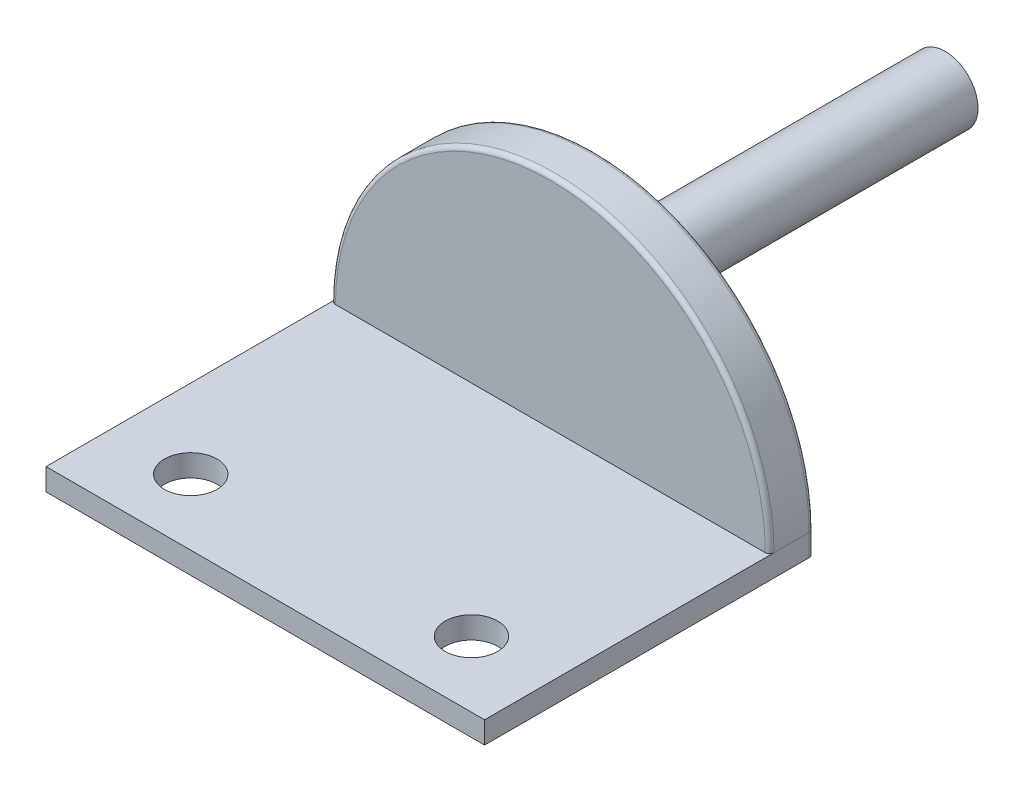
ISO-10303-21;
HEADER;
FILE_DESCRIPTION(('STEP AP214'),'2;1');
FILE_NAME('part.step','',(''),(''),'','','');
FILE_SCHEMA(('AUTOMOTIVE_DESIGN { 1 0 10303 214 1 1 1 1 }'));
ENDSEC;
DATA;
#1=APPLICATION_CONTEXT('core data for automotive mechanical design processes');
#2=APPLICATION_PROTOCOL_DEFINITION('international standard','automotive_design',2000,#1);
#3=PRODUCT_CONTEXT('',#1,'mechanical');
#4=PRODUCT('Part','Part','',(#3));
#5=PRODUCT_RELATED_PRODUCT_CATEGORY('part','',(#4));
#6=PRODUCT_DEFINITION_FORMATION('','',#4);
#7=PRODUCT_DEFINITION_CONTEXT('part definition',#1,'design');
#8=PRODUCT_DEFINITION('design','',#6,#7);
#9=PRODUCT_DEFINITION_SHAPE('','',#8);
#10=(LENGTH_UNIT() NAMED_UNIT(*) SI_UNIT(.MILLI.,.METRE.));
#11=(NAMED_UNIT(*) PLANE_ANGLE_UNIT() SI_UNIT($,.RADIAN.));
#12=(NAMED_UNIT(*) SI_UNIT($,.STERADIAN.) SOLID_ANGLE_UNIT());
#13=UNCERTAINTY_MEASURE_WITH_UNIT(LENGTH_MEASURE(1.E-05),#10,'distance_accuracy_value','');
#14=(GEOMETRIC_REPRESENTATION_CONTEXT(3) GLOBAL_UNCERTAINTY_ASSIGNED_CONTEXT((#13)) GLOBAL_UNIT_ASSIGNED_CONTEXT((#10,
#11,#12)) REPRESENTATION_CONTEXT('',''));
#15=CARTESIAN_POINT('',(0.,0.,0.));
#16=DIRECTION('',(0.,0.,1.));
#17=DIRECTION('',(1.,0.,0.));
#18=AXIS2_PLACEMENT_3D('',#15,#16,#17);
#19=CARTESIAN_POINT('',(50.,5.,-37.5));
#20=DIRECTION('',(-1.,0.,0.));
#21=DIRECTION('',(0.,0.,1.));
#22=AXIS2_PLACEMENT_3D('',#19,#20,#21);
#23=PLANE('',#22);
#24=DIRECTION('',(0.,0.,-1.));
#25=VECTOR('',#24,1.);
#26=CARTESIAN_POINT('',(50.,0.,-37.5));
#27=LINE('',#26,#25);
#28=CARTESIAN_POINT('',(50.,0.,37.5));
#29=VERTEX_POINT('',#28);
#30=CARTESIAN_POINT('',(50.,0.,-36.5));
#31=VERTEX_POINT('',#30);
#32=EDGE_CURVE('E129',#29,#31,#27,.T.);
#33=ORIENTED_EDGE('',*,*,#32,.T.);
#34=DIRECTION('',(0.,-1.,0.));
#35=VECTOR('',#34,1.);
#36=CARTESIAN_POINT('',(50.,5.,-36.5));
#37=LINE('',#36,#35);
#38=CARTESIAN_POINT('',(50.,5.00000000000001,-36.5));
#39=VERTEX_POINT('',#38);
#40=EDGE_CURVE('E149',#31,#39,#37,.F.);
#41=ORIENTED_EDGE('',*,*,#40,.T.);
#42=DIRECTION('',(0.,0.,-1.));
#43=VECTOR('',#42,1.);
#44=CARTESIAN_POINT('',(50.,5.00000000000001,143.206253546846));
#45=LINE('',#44,#43);
#46=CARTESIAN_POINT('',(50.,5.,-28.5));
#47=VERTEX_POINT('',#46);
#48=EDGE_CURVE('E173',#47,#39,#45,.T.);
#49=ORIENTED_EDGE('',*,*,#48,.F.);
#50=DIRECTION('',(0.,0.,-1.));
#51=VECTOR('',#50,1.);
#52=CARTESIAN_POINT('',(50.,5.,-37.5));
#53=LINE('',#52,#51);
#54=CARTESIAN_POINT('',(50.,5.,37.5));
#55=VERTEX_POINT('',#54);
#56=EDGE_CURVE('E71',#55,#47,#53,.T.);
#57=ORIENTED_EDGE('',*,*,#56,.F.);
#58=DIRECTION('',(0.,-1.,0.));
#59=VECTOR('',#58,1.);
#60=CARTESIAN_POINT('',(50.,5.,37.5));
#61=LINE('',#60,#59);
#62=EDGE_CURVE('E121',#55,#29,#61,.T.);
#63=ORIENTED_EDGE('',*,*,#62,.T.);
#64=EDGE_LOOP('',(#33,#41,#49,#57,#63));
#65=FACE_BOUND('',#64,.T.);
#66=ADVANCED_FACE('F39',(#65),#23,.F.);
#67=CARTESIAN_POINT('',(-50.,5.,-37.5));
#68=DIRECTION('',(0.,0.,1.));
#69=DIRECTION('',(1.,0.,0.));
#70=AXIS2_PLACEMENT_3D('',#67,#68,#69);
#71=PLANE('',#70);
#72=CARTESIAN_POINT('',(0.,27.,-37.5));
#73=DIRECTION('',(0.,0.,1.));
#74=DIRECTION('',(1.,0.,0.));
#75=AXIS2_PLACEMENT_3D('',#72,#73,#74);
#76=CIRCLE('',#75,7.5);
#77=CARTESIAN_POINT('',(7.5,27.,-37.5));
#78=VERTEX_POINT('',#77);
#79=EDGE_CURVE('E161',#78,#78,#76,.T.);
#80=ORIENTED_EDGE('',*,*,#79,.T.);
#81=EDGE_LOOP('',(#80));
#82=FACE_BOUND('',#81,.T.);
#83=CARTESIAN_POINT('',(0.,5.,-37.5));
#84=DIRECTION('',(0.,0.,1.));
#85=DIRECTION('',(1.,0.,0.));
#86=AXIS2_PLACEMENT_3D('',#83,#84,#85);
#87=CIRCLE('',#86,49.);
#88=CARTESIAN_POINT('',(-49.,5.,-37.5));
#89=VERTEX_POINT('',#88);
#90=CARTESIAN_POINT('',(49.,5.00000000000001,-37.5));
#91=VERTEX_POINT('',#90);
#92=EDGE_CURVE('E120',#89,#91,#87,.F.);
#93=ORIENTED_EDGE('',*,*,#92,.T.);
#94=DIRECTION('',(0.,-1.,0.));
#95=VECTOR('',#94,1.);
#96=CARTESIAN_POINT('',(49.,5.,-37.5));
#97=LINE('',#96,#95);
#98=CARTESIAN_POINT('',(49.,0.,-37.5));
#99=VERTEX_POINT('',#98);
#100=EDGE_CURVE('E142',#91,#99,#97,.T.);
#101=ORIENTED_EDGE('',*,*,#100,.T.);
#102=DIRECTION('',(-1.,0.,0.));
#103=VECTOR('',#102,1.);
#104=CARTESIAN_POINT('',(-50.,0.,-37.5));
#105=LINE('',#104,#103);
#106=CARTESIAN_POINT('',(-49.,0.,-37.5));
#107=VERTEX_POINT('',#106);
#108=EDGE_CURVE('E132',#99,#107,#105,.T.);
#109=ORIENTED_EDGE('',*,*,#108,.T.);
#110=DIRECTION('',(0.,-1.,0.));
#111=VECTOR('',#110,1.);
#112=CARTESIAN_POINT('',(-49.,5.,-37.5));
#113=LINE('',#112,#111);
#114=EDGE_CURVE('E140',#107,#89,#113,.F.);
#115=ORIENTED_EDGE('',*,*,#114,.T.);
#116=EDGE_LOOP('',(#93,#101,#109,#115));
#117=FACE_BOUND('',#116,.T.);
#118=ADVANCED_FACE('F214',(#82,#117),#71,.F.);
#119=CARTESIAN_POINT('',(-50.,55.,-27.5));
#120=DIRECTION('',(0.,0.,-1.));
#121=DIRECTION('',(-1.,0.,0.));
#122=AXIS2_PLACEMENT_3D('',#119,#120,#121);
#123=PLANE('',#122);
#124=DIRECTION('',(1.,0.,0.));
#125=VECTOR('',#124,1.);
#126=CARTESIAN_POINT('',(-50.,5.,-27.5));
#127=LINE('',#126,#125);
#128=CARTESIAN_POINT('',(-49.,5.,-27.5));
#129=VERTEX_POINT('',#128);
#130=CARTESIAN_POINT('',(49.,5.,-27.5));
#131=VERTEX_POINT('',#130);
#132=EDGE_CURVE('E170',#129,#131,#127,.T.);
#133=ORIENTED_EDGE('',*,*,#132,.T.);
#134=CARTESIAN_POINT('',(0.,5.,-27.5));
#135=DIRECTION('',(0.,0.,-1.));
#136=DIRECTION('',(-1.,0.,0.));
#137=AXIS2_PLACEMENT_3D('',#134,#135,#136);
#138=CIRCLE('',#137,49.);
#139=EDGE_CURVE('E166',#131,#129,#138,.F.);
#140=ORIENTED_EDGE('',*,*,#139,.T.);
#141=EDGE_LOOP('',(#133,#140));
#142=FACE_BOUND('',#141,.T.);
#143=ADVANCED_FACE('F169',(#142),#123,.F.);
#144=CARTESIAN_POINT('',(0.,5.,0.));
#145=DIRECTION('',(0.,1.,0.));
#146=DIRECTION('',(0.,0.,1.));
#147=AXIS2_PLACEMENT_3D('',#144,#145,#146);
#148=PLANE('',#147);
#149=ORIENTED_EDGE('',*,*,#132,.F.);
#150=CARTESIAN_POINT('',(-49.,5.,-28.5));
#151=DIRECTION('',(0.,1.,0.));
#152=DIRECTION('',(0.,0.,1.));
#153=AXIS2_PLACEMENT_3D('',#150,#151,#152);
#154=CIRCLE('',#153,1.);
#155=CARTESIAN_POINT('',(-50.,5.,-28.5));
#156=VERTEX_POINT('',#155);
#157=EDGE_CURVE('E11',#129,#156,#154,.F.);
#158=ORIENTED_EDGE('',*,*,#157,.T.);
#159=DIRECTION('',(0.,0.,1.));
#160=VECTOR('',#159,1.);
#161=CARTESIAN_POINT('',(-50.,5.,-37.5));
#162=LINE('',#161,#160);
#163=CARTESIAN_POINT('',(-50.,5.,37.5));
#164=VERTEX_POINT('',#163);
#165=EDGE_CURVE('E54',#156,#164,#162,.T.);
#166=ORIENTED_EDGE('',*,*,#165,.T.);
#167=DIRECTION('',(1.,0.,0.));
#168=VECTOR('',#167,1.);
#169=CARTESIAN_POINT('',(-50.,5.,37.5));
#170=LINE('',#169,#168);
#171=EDGE_CURVE('E108',#164,#55,#170,.T.);
#172=ORIENTED_EDGE('',*,*,#171,.T.);
#173=ORIENTED_EDGE('',*,*,#56,.T.);
#174=CARTESIAN_POINT('',(49.,5.,-28.5));
#175=DIRECTION('',(0.,1.,0.));
#176=DIRECTION('',(0.,0.,1.));
#177=AXIS2_PLACEMENT_3D('',#174,#175,#176);
#178=CIRCLE('',#177,1.);
#179=EDGE_CURVE('E47',#47,#131,#178,.F.);
#180=ORIENTED_EDGE('',*,*,#179,.T.);
#181=EDGE_LOOP('',(#149,#158,#166,#172,#173,#180));
#182=FACE_BOUND('',#181,.T.);
#183=CARTESIAN_POINT('',(-32.,5.,22.5));
#184=DIRECTION('',(0.,1.,0.));
#185=DIRECTION('',(0.,0.,1.));
#186=AXIS2_PLACEMENT_3D('',#183,#184,#185);
#187=CIRCLE('',#186,6.);
#188=CARTESIAN_POINT('',(-32.,5.,28.5));
#189=VERTEX_POINT('',#188);
#190=EDGE_CURVE('E133',#189,#189,#187,.T.);
#191=ORIENTED_EDGE('',*,*,#190,.F.);
#192=EDGE_LOOP('',(#191));
#193=FACE_BOUND('',#192,.T.);
#194=CARTESIAN_POINT('',(32.,5.,22.5));
#195=DIRECTION('',(0.,1.,0.));
#196=DIRECTION('',(0.,0.,1.));
#197=AXIS2_PLACEMENT_3D('',#194,#195,#196);
#198=CIRCLE('',#197,5.99999999999999);
#199=CARTESIAN_POINT('',(32.,5.,28.5));
#200=VERTEX_POINT('',#199);
#201=EDGE_CURVE('E186',#200,#200,#198,.T.);
#202=ORIENTED_EDGE('',*,*,#201,.F.);
#203=EDGE_LOOP('',(#202));
#204=FACE_BOUND('',#203,.T.);
#205=ADVANCED_FACE('F105',(#182,#193,#204),#148,.T.);
#206=CARTESIAN_POINT('',(0.,0.,0.));
#207=DIRECTION('',(0.,1.,0.));
#208=DIRECTION('',(0.,0.,1.));
#209=AXIS2_PLACEMENT_3D('',#206,#207,#208);
#210=PLANE('',#209);
#211=ORIENTED_EDGE('',*,*,#108,.F.);
#212=CARTESIAN_POINT('',(49.,0.,-36.5));
#213=DIRECTION('',(0.,1.,0.));
#214=DIRECTION('',(0.,0.,1.));
#215=AXIS2_PLACEMENT_3D('',#212,#213,#214);
#216=CIRCLE('',#215,1.);
#217=EDGE_CURVE('E147',#99,#31,#216,.F.);
#218=ORIENTED_EDGE('',*,*,#217,.T.);
#219=ORIENTED_EDGE('',*,*,#32,.F.);
#220=DIRECTION('',(1.,0.,0.));
#221=VECTOR('',#220,1.);
#222=CARTESIAN_POINT('',(-50.,0.,37.5));
#223=LINE('',#222,#221);
#224=CARTESIAN_POINT('',(-50.,0.,37.5));
#225=VERTEX_POINT('',#224);
#226=EDGE_CURVE('E137',#225,#29,#223,.T.);
#227=ORIENTED_EDGE('',*,*,#226,.F.);
#228=DIRECTION('',(0.,0.,1.));
#229=VECTOR('',#228,1.);
#230=CARTESIAN_POINT('',(-50.,0.,-37.5));
#231=LINE('',#230,#229);
#232=CARTESIAN_POINT('',(-50.,0.,-36.5));
#233=VERTEX_POINT('',#232);
#234=EDGE_CURVE('E117',#233,#225,#231,.T.);
#235=ORIENTED_EDGE('',*,*,#234,.F.);
#236=CARTESIAN_POINT('',(-49.,0.,-36.5));
#237=DIRECTION('',(0.,1.,0.));
#238=DIRECTION('',(0.,0.,1.));
#239=AXIS2_PLACEMENT_3D('',#236,#237,#238);
#240=CIRCLE('',#239,1.);
#241=EDGE_CURVE('E145',#233,#107,#240,.F.);
#242=ORIENTED_EDGE('',*,*,#241,.T.);
#243=EDGE_LOOP('',(#211,#218,#219,#227,#235,#242));
#244=FACE_BOUND('',#243,.T.);
#245=CARTESIAN_POINT('',(-32.,0.,22.5));
#246=DIRECTION('',(0.,1.,0.));
#247=DIRECTION('',(0.,0.,1.));
#248=AXIS2_PLACEMENT_3D('',#245,#246,#247);
#249=CIRCLE('',#248,6.);
#250=CARTESIAN_POINT('',(-32.,0.,28.5));
#251=VERTEX_POINT('',#250);
#252=EDGE_CURVE('E189',#251,#251,#249,.T.);
#253=ORIENTED_EDGE('',*,*,#252,.T.);
#254=EDGE_LOOP('',(#253));
#255=FACE_BOUND('',#254,.T.);
#256=CARTESIAN_POINT('',(32.,0.,22.5));
#257=DIRECTION('',(0.,1.,0.));
#258=DIRECTION('',(0.,0.,1.));
#259=AXIS2_PLACEMENT_3D('',#256,#257,#258);
#260=CIRCLE('',#259,5.99999999999999);
#261=CARTESIAN_POINT('',(32.,0.,28.5));
#262=VERTEX_POINT('',#261);
#263=EDGE_CURVE('E172',#262,#262,#260,.T.);
#264=ORIENTED_EDGE('',*,*,#263,.T.);
#265=EDGE_LOOP('',(#264));
#266=FACE_BOUND('',#265,.T.);
#267=ADVANCED_FACE('F197',(#244,#255,#266),#210,.F.);
#268=CARTESIAN_POINT('',(-50.,5.,-37.5));
#269=DIRECTION('',(1.,0.,0.));
#270=DIRECTION('',(0.,0.,-1.));
#271=AXIS2_PLACEMENT_3D('',#268,#269,#270);
#272=PLANE('',#271);
#273=ORIENTED_EDGE('',*,*,#165,.F.);
#274=DIRECTION('',(0.,0.,-1.));
#275=VECTOR('',#274,1.);
#276=CARTESIAN_POINT('',(-50.,5.,143.206253546846));
#277=LINE('',#276,#275);
#278=CARTESIAN_POINT('',(-50.,5.,-36.5));
#279=VERTEX_POINT('',#278);
#280=EDGE_CURVE('E74',#156,#279,#277,.T.);
#281=ORIENTED_EDGE('',*,*,#280,.T.);
#282=DIRECTION('',(0.,-1.,0.));
#283=VECTOR('',#282,1.);
#284=CARTESIAN_POINT('',(-50.,5.,-36.5));
#285=LINE('',#284,#283);
#286=EDGE_CURVE('E152',#279,#233,#285,.T.);
#287=ORIENTED_EDGE('',*,*,#286,.T.);
#288=ORIENTED_EDGE('',*,*,#234,.T.);
#289=DIRECTION('',(0.,-1.,0.));
#290=VECTOR('',#289,1.);
#291=CARTESIAN_POINT('',(-50.,5.,37.5));
#292=LINE('',#291,#290);
#293=EDGE_CURVE('E114',#164,#225,#292,.T.);
#294=ORIENTED_EDGE('',*,*,#293,.F.);
#295=EDGE_LOOP('',(#273,#281,#287,#288,#294));
#296=FACE_BOUND('',#295,.T.);
#297=ADVANCED_FACE('F115',(#296),#272,.F.);
#298=CARTESIAN_POINT('',(-50.,5.,37.5));
#299=DIRECTION('',(0.,0.,-1.));
#300=DIRECTION('',(-1.,0.,0.));
#301=AXIS2_PLACEMENT_3D('',#298,#299,#300);
#302=PLANE('',#301);
#303=ORIENTED_EDGE('',*,*,#226,.T.);
#304=ORIENTED_EDGE('',*,*,#62,.F.);
#305=ORIENTED_EDGE('',*,*,#171,.F.);
#306=ORIENTED_EDGE('',*,*,#293,.T.);
#307=EDGE_LOOP('',(#303,#304,#305,#306));
#308=FACE_BOUND('',#307,.T.);
#309=ADVANCED_FACE('F123',(#308),#302,.F.);
#310=CARTESIAN_POINT('',(-32.,5.,22.5));
#311=DIRECTION('',(0.,-1.,0.));
#312=DIRECTION('',(0.,0.,-1.));
#313=AXIS2_PLACEMENT_3D('',#310,#311,#312);
#314=CYLINDRICAL_SURFACE('',#313,6.);
#315=ORIENTED_EDGE('',*,*,#190,.T.);
#316=EDGE_LOOP('',(#315));
#317=FACE_BOUND('',#316,.T.);
#318=ORIENTED_EDGE('',*,*,#252,.F.);
#319=EDGE_LOOP('',(#318));
#320=FACE_BOUND('',#319,.T.);
#321=ADVANCED_FACE('F200',(#317,#320),#314,.F.);
#322=CARTESIAN_POINT('',(32.,5.,22.5));
#323=DIRECTION('',(0.,-1.,0.));
#324=DIRECTION('',(0.,0.,-1.));
#325=AXIS2_PLACEMENT_3D('',#322,#323,#324);
#326=CYLINDRICAL_SURFACE('',#325,5.99999999999999);
#327=ORIENTED_EDGE('',*,*,#201,.T.);
#328=EDGE_LOOP('',(#327));
#329=FACE_BOUND('',#328,.T.);
#330=ORIENTED_EDGE('',*,*,#263,.F.);
#331=EDGE_LOOP('',(#330));
#332=FACE_BOUND('',#331,.T.);
#333=ADVANCED_FACE('F202',(#329,#332),#326,.F.);
#334=CARTESIAN_POINT('',(0.,5.,143.206253546846));
#335=DIRECTION('',(0.,0.,-1.));
#336=DIRECTION('',(-1.,0.,0.));
#337=AXIS2_PLACEMENT_3D('',#334,#335,#336);
#338=CYLINDRICAL_SURFACE('',#337,50.);
#339=ORIENTED_EDGE('',*,*,#280,.F.);
#340=CARTESIAN_POINT('',(0.,5.,-28.5));
#341=DIRECTION('',(0.,0.,-1.));
#342=DIRECTION('',(-1.,0.,0.));
#343=AXIS2_PLACEMENT_3D('',#340,#341,#342);
#344=CIRCLE('',#343,50.);
#345=EDGE_CURVE('E156',#156,#47,#344,.T.);
#346=ORIENTED_EDGE('',*,*,#345,.T.);
#347=ORIENTED_EDGE('',*,*,#48,.T.);
#348=CARTESIAN_POINT('',(0.,5.,-36.5));
#349=DIRECTION('',(0.,0.,1.));
#350=DIRECTION('',(1.,0.,0.));
#351=AXIS2_PLACEMENT_3D('',#348,#349,#350);
#352=CIRCLE('',#351,50.);
#353=EDGE_CURVE('E154',#39,#279,#352,.T.);
#354=ORIENTED_EDGE('',*,*,#353,.T.);
#355=EDGE_LOOP('',(#339,#346,#347,#354));
#356=FACE_BOUND('',#355,.T.);
#357=ADVANCED_FACE('F177',(#356),#338,.T.);
#358=CARTESIAN_POINT('',(-49.,5.,-36.5));
#359=DIRECTION('',(0.,-1.,0.));
#360=DIRECTION('',(0.,0.,-1.));
#361=AXIS2_PLACEMENT_3D('',#358,#359,#360);
#362=CYLINDRICAL_SURFACE('',#361,1.);
#363=ORIENTED_EDGE('',*,*,#241,.F.);
#364=ORIENTED_EDGE('',*,*,#286,.F.);
#365=CARTESIAN_POINT('',(-49.,5.,-36.5));
#366=DIRECTION('',(0.,1.,0.));
#367=DIRECTION('',(0.,0.,1.));
#368=AXIS2_PLACEMENT_3D('',#365,#366,#367);
#369=CIRCLE('',#368,1.);
#370=EDGE_CURVE('E160',#89,#279,#369,.T.);
#371=ORIENTED_EDGE('',*,*,#370,.F.);
#372=ORIENTED_EDGE('',*,*,#114,.F.);
#373=EDGE_LOOP('',(#363,#364,#371,#372));
#374=FACE_BOUND('',#373,.T.);
#375=ADVANCED_FACE('F230',(#374),#362,.T.);
#376=CARTESIAN_POINT('',(0.,5.,-36.5));
#377=DIRECTION('',(0.,0.,1.));
#378=DIRECTION('',(1.,0.,0.));
#379=AXIS2_PLACEMENT_3D('',#376,#377,#378);
#380=TOROIDAL_SURFACE('',#379,49.,1.);
#381=ORIENTED_EDGE('',*,*,#370,.T.);
#382=ORIENTED_EDGE('',*,*,#353,.F.);
#383=CARTESIAN_POINT('',(49.,5.00000000000001,-36.5));
#384=DIRECTION('',(0.,-1.,0.));
#385=DIRECTION('',(0.,0.,-1.));
#386=AXIS2_PLACEMENT_3D('',#383,#384,#385);
#387=CIRCLE('',#386,1.);
#388=EDGE_CURVE('E157',#91,#39,#387,.T.);
#389=ORIENTED_EDGE('',*,*,#388,.F.);
#390=ORIENTED_EDGE('',*,*,#92,.F.);
#391=EDGE_LOOP('',(#381,#382,#389,#390));
#392=FACE_BOUND('',#391,.T.);
#393=ADVANCED_FACE('F227',(#392),#380,.T.);
#394=CARTESIAN_POINT('',(49.,5.,-36.5));
#395=DIRECTION('',(0.,-1.,0.));
#396=DIRECTION('',(0.,0.,-1.));
#397=AXIS2_PLACEMENT_3D('',#394,#395,#396);
#398=CYLINDRICAL_SURFACE('',#397,1.);
#399=ORIENTED_EDGE('',*,*,#388,.T.);
#400=ORIENTED_EDGE('',*,*,#40,.F.);
#401=ORIENTED_EDGE('',*,*,#217,.F.);
#402=ORIENTED_EDGE('',*,*,#100,.F.);
#403=EDGE_LOOP('',(#399,#400,#401,#402));
#404=FACE_BOUND('',#403,.T.);
#405=ADVANCED_FACE('F225',(#404),#398,.T.);
#406=CARTESIAN_POINT('',(0.,5.,-28.5));
#407=DIRECTION('',(0.,0.,-1.));
#408=DIRECTION('',(-1.,0.,0.));
#409=AXIS2_PLACEMENT_3D('',#406,#407,#408);
#410=TOROIDAL_SURFACE('',#409,49.,1.);
#411=ORIENTED_EDGE('',*,*,#157,.F.);
#412=ORIENTED_EDGE('',*,*,#139,.F.);
#413=ORIENTED_EDGE('',*,*,#179,.F.);
#414=ORIENTED_EDGE('',*,*,#345,.F.);
#415=EDGE_LOOP('',(#411,#412,#413,#414));
#416=FACE_BOUND('',#415,.T.);
#417=ADVANCED_FACE('F41',(#416),#410,.T.);
#418=CARTESIAN_POINT('',(0.,27.,-117.5));
#419=DIRECTION('',(0.,0.,1.));
#420=DIRECTION('',(1.,0.,0.));
#421=AXIS2_PLACEMENT_3D('',#418,#419,#420);
#422=CYLINDRICAL_SURFACE('',#421,7.5);
#423=CARTESIAN_POINT('',(0.,27.,-117.5));
#424=DIRECTION('',(0.,0.,1.));
#425=DIRECTION('',(1.,0.,0.));
#426=AXIS2_PLACEMENT_3D('',#423,#424,#425);
#427=CIRCLE('',#426,7.5);
#428=CARTESIAN_POINT('',(7.5,27.,-117.5));
#429=VERTEX_POINT('',#428);
#430=EDGE_CURVE('E272',#429,#429,#427,.T.);
#431=CARTESIAN_POINT('',(7.5,27.,-117.5));
#432=CARTESIAN_POINT('',(7.5,27.,-116.666666666667));
#433=CARTESIAN_POINT('',(7.5,27.,-115.833333333333));
#434=CARTESIAN_POINT('',(7.5,27.,-114.166666666667));
#435=CARTESIAN_POINT('',(7.5,27.,-113.333333333333));
#436=CARTESIAN_POINT('',(7.5,27.,-111.666666666667));
#437=CARTESIAN_POINT('',(7.5,27.,-110.833333333333));
#438=CARTESIAN_POINT('',(7.5,27.,-109.166666666667));
#439=CARTESIAN_POINT('',(7.5,27.,-108.333333333333));
#440=CARTESIAN_POINT('',(7.5,27.,-106.666666666667));
#441=CARTESIAN_POINT('',(7.5,27.,-105.833333333333));
#442=CARTESIAN_POINT('',(7.5,27.,-104.166666666667));
#443=CARTESIAN_POINT('',(7.5,27.,-103.333333333333));
#444=CARTESIAN_POINT('',(7.5,27.,-101.666666666667));
#445=CARTESIAN_POINT('',(7.5,27.,-100.833333333333));
#446=CARTESIAN_POINT('',(7.5,27.,-99.1666666666667));
#447=CARTESIAN_POINT('',(7.5,27.,-98.3333333333334));
#448=CARTESIAN_POINT('',(7.5,27.,-96.6666666666667));
#449=CARTESIAN_POINT('',(7.5,27.,-95.8333333333334));
#450=CARTESIAN_POINT('',(7.5,27.,-94.1666666666667));
#451=CARTESIAN_POINT('',(7.5,27.,-93.3333333333334));
#452=CARTESIAN_POINT('',(7.5,27.,-91.6666666666667));
#453=CARTESIAN_POINT('',(7.5,27.,-90.8333333333334));
#454=CARTESIAN_POINT('',(7.5,27.,-89.1666666666667));
#455=CARTESIAN_POINT('',(7.5,27.,-88.3333333333334));
#456=CARTESIAN_POINT('',(7.5,27.,-86.6666666666667));
#457=CARTESIAN_POINT('',(7.5,27.,-85.8333333333334));
#458=CARTESIAN_POINT('',(7.5,27.,-84.1666666666667));
#459=CARTESIAN_POINT('',(7.5,27.,-83.3333333333334));
#460=CARTESIAN_POINT('',(7.5,27.,-81.6666666666667));
#461=CARTESIAN_POINT('',(7.5,27.,-80.8333333333334));
#462=CARTESIAN_POINT('',(7.5,27.,-79.1666666666667));
#463=CARTESIAN_POINT('',(7.5,27.,-78.3333333333334));
#464=CARTESIAN_POINT('',(7.5,27.,-76.6666666666667));
#465=CARTESIAN_POINT('',(7.5,27.,-75.8333333333334));
#466=CARTESIAN_POINT('',(7.5,27.,-74.1666666666667));
#467=CARTESIAN_POINT('',(7.5,27.,-73.3333333333334));
#468=CARTESIAN_POINT('',(7.5,27.,-71.6666666666667));
#469=CARTESIAN_POINT('',(7.5,27.,-70.8333333333334));
#470=CARTESIAN_POINT('',(7.5,27.,-69.1666666666667));
#471=CARTESIAN_POINT('',(7.5,27.,-68.3333333333334));
#472=CARTESIAN_POINT('',(7.5,27.,-66.6666666666667));
#473=CARTESIAN_POINT('',(7.5,27.,-65.8333333333334));
#474=CARTESIAN_POINT('',(7.5,27.,-64.1666666666667));
#475=CARTESIAN_POINT('',(7.5,27.,-63.3333333333334));
#476=CARTESIAN_POINT('',(7.5,27.,-61.6666666666667));
#477=CARTESIAN_POINT('',(7.5,27.,-60.8333333333334));
#478=CARTESIAN_POINT('',(7.5,27.,-59.1666666666667));
#479=CARTESIAN_POINT('',(7.5,27.,-58.3333333333334));
#480=CARTESIAN_POINT('',(7.5,27.,-56.6666666666667));
#481=CARTESIAN_POINT('',(7.5,27.,-55.8333333333333));
#482=CARTESIAN_POINT('',(7.5,27.,-54.1666666666667));
#483=CARTESIAN_POINT('',(7.5,27.,-53.3333333333333));
#484=CARTESIAN_POINT('',(7.5,27.,-51.6666666666667));
#485=CARTESIAN_POINT('',(7.5,27.,-50.8333333333333));
#486=CARTESIAN_POINT('',(7.5,27.,-49.1666666666667));
#487=CARTESIAN_POINT('',(7.5,27.,-48.3333333333334));
#488=CARTESIAN_POINT('',(7.5,27.,-46.6666666666667));
#489=CARTESIAN_POINT('',(7.5,27.,-45.8333333333334));
#490=CARTESIAN_POINT('',(7.5,27.,-44.1666666666667));
#491=CARTESIAN_POINT('',(7.5,27.,-43.3333333333334));
#492=CARTESIAN_POINT('',(7.5,27.,-41.6666666666667));
#493=CARTESIAN_POINT('',(7.5,27.,-40.8333333333333));
#494=CARTESIAN_POINT('',(7.5,27.,-39.1666666666667));
#495=CARTESIAN_POINT('',(7.5,27.,-38.3333333333333));
#496=CARTESIAN_POINT('',(7.5,27.,-37.5));
#497=B_SPLINE_CURVE_WITH_KNOTS('',3,(#431,#432,#433,#434,#435,#436,#437,#438,#439,#440,#441,
#442,#443,#444,#445,#446,#447,#448,#449,#450,#451,#452,#453,#454,#455,#456,#457,#458,#459,#460,
#461,#462,#463,#464,#465,#466,#467,#468,#469,#470,#471,#472,#473,#474,#475,#476,#477,#478,#479,
#480,#481,#482,#483,#484,#485,#486,#487,#488,#489,#490,#491,#492,#493,#494,#495,#496),
.UNSPECIFIED.,.F.,.F.,(4,2,2,2,2,2,2,2,2,2,2,2,2,2,2,2,2,2,2,2,2,2,2,2,2,2,2,2,2,2,2,2,4),(0.,
2.49999999999999,4.99999999999999,7.49999999999999,9.99999999999999,12.5,15.,17.5,20.,22.5,25.,
27.5,30.,32.5,35.,37.5,40.,42.5,45.,47.5,50.,52.5,55.,57.5,60.,62.5,65.,67.5,70.,72.5,75.,77.5,
80.),.UNSPECIFIED.);
#498=EDGE_CURVE('BSEAM262',#429,#78,#497,.T.);
#499=ORIENTED_EDGE('',*,*,#430,.T.);
#500=ORIENTED_EDGE('',*,*,#79,.F.);
#501=ORIENTED_EDGE('',*,*,#498,.T.);
#502=ORIENTED_EDGE('',*,*,#498,.F.);
#503=EDGE_LOOP('',(#499,#501,#500,#502));
#504=FACE_BOUND('',#503,.T.);
#505=ADVANCED_FACE('F262',(#504),#422,.T.);
#506=CARTESIAN_POINT('',(0.,27.,-117.5));
#507=DIRECTION('',(0.,0.,1.));
#508=DIRECTION('',(1.,0.,0.));
#509=AXIS2_PLACEMENT_3D('',#506,#507,#508);
#510=PLANE('',#509);
#511=ORIENTED_EDGE('',*,*,#430,.F.);
#512=EDGE_LOOP('',(#511));
#513=FACE_BOUND('',#512,.T.);
#514=ADVANCED_FACE('F264',(#513),#510,.F.);
#515=CLOSED_SHELL('',(#66,#118,#143,#205,#267,#297,#309,#321,#333,#357,#375,#393,#405,#417,#505,#514));
#516=MANIFOLD_SOLID_BREP('B2',#515);
#517=ADVANCED_BREP_SHAPE_REPRESENTATION('',(#18,#516),#14);
#518=SHAPE_DEFINITION_REPRESENTATION(#9,#517);
ENDSEC;
END-ISO-10303-21;
